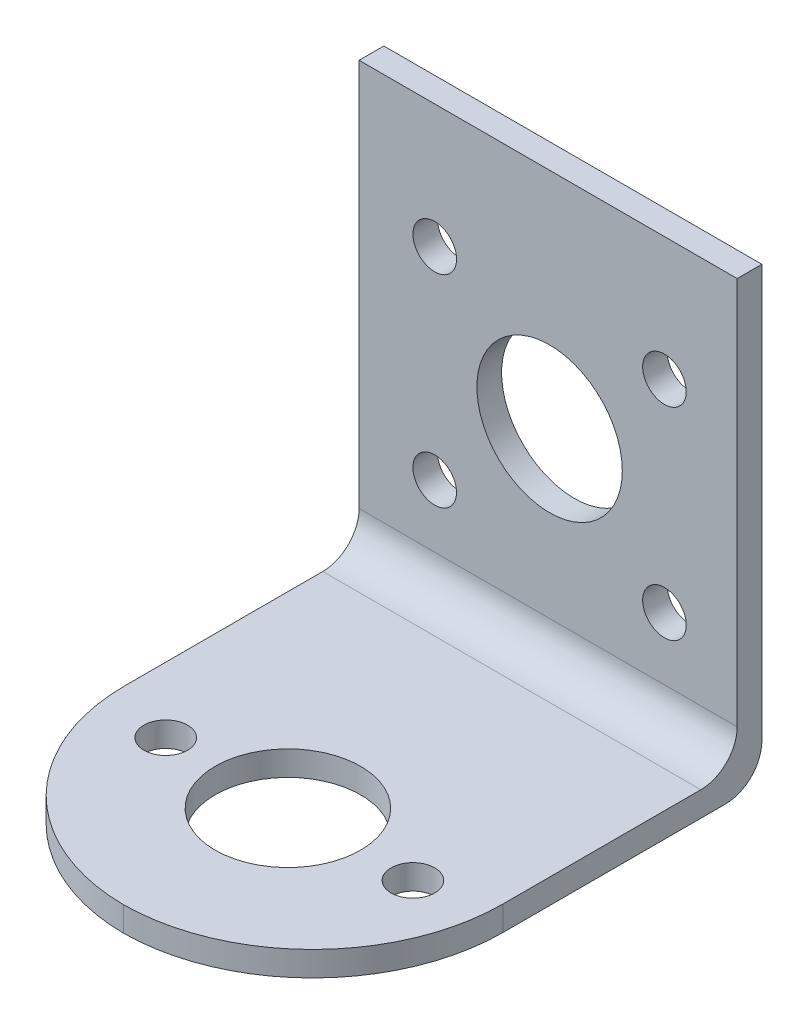
ISO-10303-21;
HEADER;
FILE_DESCRIPTION(('STEP AP214'),'2;1');
FILE_NAME('part.step','',(''),(''),'','','');
FILE_SCHEMA(('AUTOMOTIVE_DESIGN { 1 0 10303 214 1 1 1 1 }'));
ENDSEC;
DATA;
#1=APPLICATION_CONTEXT('core data for automotive mechanical design processes');
#2=APPLICATION_PROTOCOL_DEFINITION('international standard','automotive_design',2000,#1);
#3=PRODUCT_CONTEXT('',#1,'mechanical');
#4=PRODUCT('Part','Part','',(#3));
#5=PRODUCT_RELATED_PRODUCT_CATEGORY('part','',(#4));
#6=PRODUCT_DEFINITION_FORMATION('','',#4);
#7=PRODUCT_DEFINITION_CONTEXT('part definition',#1,'design');
#8=PRODUCT_DEFINITION('design','',#6,#7);
#9=PRODUCT_DEFINITION_SHAPE('','',#8);
#10=(LENGTH_UNIT() NAMED_UNIT(*) SI_UNIT(.MILLI.,.METRE.));
#11=(NAMED_UNIT(*) PLANE_ANGLE_UNIT() SI_UNIT($,.RADIAN.));
#12=(NAMED_UNIT(*) SI_UNIT($,.STERADIAN.) SOLID_ANGLE_UNIT());
#13=UNCERTAINTY_MEASURE_WITH_UNIT(LENGTH_MEASURE(1.E-05),#10,'distance_accuracy_value','');
#14=(GEOMETRIC_REPRESENTATION_CONTEXT(3) GLOBAL_UNCERTAINTY_ASSIGNED_CONTEXT((#13)) GLOBAL_UNIT_ASSIGNED_CONTEXT((#10,
#11,#12)) REPRESENTATION_CONTEXT('',''));
#15=CARTESIAN_POINT('',(0.,0.,0.));
#16=DIRECTION('',(0.,0.,1.));
#17=DIRECTION('',(1.,0.,0.));
#18=AXIS2_PLACEMENT_3D('',#15,#16,#17);
#19=CARTESIAN_POINT('',(-0.0999997773975889,-15.45,17.8));
#20=DIRECTION('',(0.,1.,0.));
#21=DIRECTION('',(0.,0.,1.));
#22=AXIS2_PLACEMENT_3D('',#19,#20,#21);
#23=CYLINDRICAL_SURFACE('',#22,13.1);
#24=CARTESIAN_POINT('',(-0.0999997773975889,-13.75,17.8));
#25=DIRECTION('',(0.,1.,0.));
#26=DIRECTION('',(0.,0.,1.));
#27=AXIS2_PLACEMENT_3D('',#24,#25,#26);
#28=CIRCLE('',#27,13.1);
#29=CARTESIAN_POINT('',(1.11301268792803E-07,-13.75,30.8996183158999));
#30=VERTEX_POINT('',#29);
#31=CARTESIAN_POINT('',(13.0000002226024,-13.75,17.8));
#32=VERTEX_POINT('',#31);
#33=EDGE_CURVE('E150',#30,#32,#28,.T.);
#34=ORIENTED_EDGE('',*,*,#33,.F.);
#35=DIRECTION('',(0.,1.,0.));
#36=VECTOR('',#35,1.);
#37=CARTESIAN_POINT('',(1.11301268792803E-07,-15.45,30.8996183158999));
#38=LINE('',#37,#36);
#39=CARTESIAN_POINT('',(1.11301268792803E-07,-15.45,30.8996183158999));
#40=VERTEX_POINT('',#39);
#41=EDGE_CURVE('E170',#40,#30,#38,.T.);
#42=ORIENTED_EDGE('',*,*,#41,.F.);
#43=CARTESIAN_POINT('',(-0.0999997773975889,-15.45,17.8));
#44=DIRECTION('',(0.,1.,0.));
#45=DIRECTION('',(0.,0.,1.));
#46=AXIS2_PLACEMENT_3D('',#43,#44,#45);
#47=CIRCLE('',#46,13.1);
#48=CARTESIAN_POINT('',(13.0000002226024,-15.45,17.8));
#49=VERTEX_POINT('',#48);
#50=EDGE_CURVE('E151',#40,#49,#47,.T.);
#51=ORIENTED_EDGE('',*,*,#50,.T.);
#52=DIRECTION('',(0.,1.,0.));
#53=VECTOR('',#52,1.);
#54=CARTESIAN_POINT('',(13.0000002226024,-15.45,17.8));
#55=LINE('',#54,#53);
#56=EDGE_CURVE('E122',#49,#32,#55,.T.);
#57=ORIENTED_EDGE('',*,*,#56,.T.);
#58=EDGE_LOOP('',(#34,#42,#51,#57));
#59=FACE_BOUND('',#58,.T.);
#60=ADVANCED_FACE('F41',(#59),#23,.T.);
#61=CARTESIAN_POINT('',(0.1,-15.45,17.8));
#62=DIRECTION('',(0.,1.,0.));
#63=DIRECTION('',(0.,0.,1.));
#64=AXIS2_PLACEMENT_3D('',#61,#62,#63);
#65=CYLINDRICAL_SURFACE('',#64,13.1);
#66=CARTESIAN_POINT('',(0.1,-13.75,17.8));
#67=DIRECTION('',(0.,1.,0.));
#68=DIRECTION('',(0.,0.,1.));
#69=AXIS2_PLACEMENT_3D('',#66,#67,#68);
#70=CIRCLE('',#69,13.1);
#71=CARTESIAN_POINT('',(-13.,-13.75,17.8));
#72=VERTEX_POINT('',#71);
#73=EDGE_CURVE('E155',#72,#30,#70,.T.);
#74=ORIENTED_EDGE('',*,*,#73,.F.);
#75=DIRECTION('',(0.,1.,0.));
#76=VECTOR('',#75,1.);
#77=CARTESIAN_POINT('',(-13.,-15.45,17.8));
#78=LINE('',#77,#76);
#79=CARTESIAN_POINT('',(-13.,-15.45,17.8));
#80=VERTEX_POINT('',#79);
#81=EDGE_CURVE('E173',#80,#72,#78,.T.);
#82=ORIENTED_EDGE('',*,*,#81,.F.);
#83=CARTESIAN_POINT('',(0.1,-15.45,17.8));
#84=DIRECTION('',(0.,1.,0.));
#85=DIRECTION('',(0.,0.,1.));
#86=AXIS2_PLACEMENT_3D('',#83,#84,#85);
#87=CIRCLE('',#86,13.1);
#88=EDGE_CURVE('E159',#80,#40,#87,.T.);
#89=ORIENTED_EDGE('',*,*,#88,.T.);
#90=ORIENTED_EDGE('',*,*,#41,.T.);
#91=EDGE_LOOP('',(#74,#82,#89,#90));
#92=FACE_BOUND('',#91,.T.);
#93=ADVANCED_FACE('F218',(#92),#65,.T.);
#94=CARTESIAN_POINT('',(-13.,-15.45,0.));
#95=DIRECTION('',(-1.,0.,0.));
#96=DIRECTION('',(0.,0.,1.));
#97=AXIS2_PLACEMENT_3D('',#94,#95,#96);
#98=PLANE('',#97);
#99=DIRECTION('',(0.,1.,0.));
#100=VECTOR('',#99,1.);
#101=CARTESIAN_POINT('',(-13.,-15.45,0.));
#102=LINE('',#101,#100);
#103=CARTESIAN_POINT('',(-13.,-12.95,0.));
#104=VERTEX_POINT('',#103);
#105=CARTESIAN_POINT('',(-13.,15.45,0.));
#106=VERTEX_POINT('',#105);
#107=EDGE_CURVE('E121',#104,#106,#102,.T.);
#108=ORIENTED_EDGE('',*,*,#107,.F.);
#109=CARTESIAN_POINT('',(-13.,-12.95,2.5));
#110=DIRECTION('',(-1.,0.,0.));
#111=DIRECTION('',(0.,0.,1.));
#112=AXIS2_PLACEMENT_3D('',#109,#110,#111);
#113=CIRCLE('',#112,2.5);
#114=CARTESIAN_POINT('',(-13.,-15.45,2.5));
#115=VERTEX_POINT('',#114);
#116=EDGE_CURVE('E179',#104,#115,#113,.T.);
#117=ORIENTED_EDGE('',*,*,#116,.T.);
#118=DIRECTION('',(0.,0.,1.));
#119=VECTOR('',#118,1.);
#120=CARTESIAN_POINT('',(-13.,-15.45,0.));
#121=LINE('',#120,#119);
#122=EDGE_CURVE('E157',#115,#80,#121,.T.);
#123=ORIENTED_EDGE('',*,*,#122,.T.);
#124=ORIENTED_EDGE('',*,*,#81,.T.);
#125=DIRECTION('',(0.,0.,1.));
#126=VECTOR('',#125,1.);
#127=CARTESIAN_POINT('',(-13.,-13.75,0.));
#128=LINE('',#127,#126);
#129=CARTESIAN_POINT('',(-13.,-13.75,4.2));
#130=VERTEX_POINT('',#129);
#131=EDGE_CURVE('E166',#130,#72,#128,.T.);
#132=ORIENTED_EDGE('',*,*,#131,.F.);
#133=CARTESIAN_POINT('',(-13.,-11.25,4.2));
#134=DIRECTION('',(-1.,0.,0.));
#135=DIRECTION('',(0.,0.,1.));
#136=AXIS2_PLACEMENT_3D('',#133,#134,#135);
#137=CIRCLE('',#136,2.5);
#138=CARTESIAN_POINT('',(-13.,-11.25,1.7));
#139=VERTEX_POINT('',#138);
#140=EDGE_CURVE('E11',#130,#139,#137,.F.);
#141=ORIENTED_EDGE('',*,*,#140,.T.);
#142=DIRECTION('',(0.,-1.,0.));
#143=VECTOR('',#142,1.);
#144=CARTESIAN_POINT('',(-13.,15.45,1.7));
#145=LINE('',#144,#143);
#146=CARTESIAN_POINT('',(-13.,15.45,1.7));
#147=VERTEX_POINT('',#146);
#148=EDGE_CURVE('E147',#147,#139,#145,.T.);
#149=ORIENTED_EDGE('',*,*,#148,.F.);
#150=DIRECTION('',(0.,0.,1.));
#151=VECTOR('',#150,1.);
#152=CARTESIAN_POINT('',(-13.,15.45,1.7));
#153=LINE('',#152,#151);
#154=EDGE_CURVE('E130',#106,#147,#153,.T.);
#155=ORIENTED_EDGE('',*,*,#154,.F.);
#156=EDGE_LOOP('',(#108,#117,#123,#124,#132,#141,#149,#155));
#157=FACE_BOUND('',#156,.T.);
#158=ADVANCED_FACE('F192',(#157),#98,.T.);
#159=CARTESIAN_POINT('',(13.0000002226024,-15.45,0.));
#160=DIRECTION('',(0.,0.,-1.));
#161=DIRECTION('',(-1.,0.,0.));
#162=AXIS2_PLACEMENT_3D('',#159,#160,#161);
#163=PLANE('',#162);
#164=CARTESIAN_POINT('',(-7.8,6.95,0.));
#165=DIRECTION('',(0.,0.,1.));
#166=DIRECTION('',(1.,0.,0.));
#167=AXIS2_PLACEMENT_3D('',#164,#165,#166);
#168=CIRCLE('',#167,1.49999999999999);
#169=CARTESIAN_POINT('',(-6.30000000000001,6.95,0.));
#170=VERTEX_POINT('',#169);
#171=EDGE_CURVE('E281',#170,#170,#168,.T.);
#172=ORIENTED_EDGE('',*,*,#171,.T.);
#173=EDGE_LOOP('',(#172));
#174=FACE_BOUND('',#173,.T.);
#175=CARTESIAN_POINT('',(8.,-6.95,0.));
#176=DIRECTION('',(0.,0.,1.));
#177=DIRECTION('',(1.,0.,0.));
#178=AXIS2_PLACEMENT_3D('',#175,#176,#177);
#179=CIRCLE('',#178,1.49999999999999);
#180=CARTESIAN_POINT('',(9.49999999999999,-6.95,0.));
#181=VERTEX_POINT('',#180);
#182=EDGE_CURVE('E276',#181,#181,#179,.T.);
#183=ORIENTED_EDGE('',*,*,#182,.T.);
#184=EDGE_LOOP('',(#183));
#185=FACE_BOUND('',#184,.T.);
#186=CARTESIAN_POINT('',(-7.8,-6.95,0.));
#187=DIRECTION('',(0.,0.,1.));
#188=DIRECTION('',(1.,0.,0.));
#189=AXIS2_PLACEMENT_3D('',#186,#187,#188);
#190=CIRCLE('',#189,1.49999999999999);
#191=CARTESIAN_POINT('',(-6.30000000000001,-6.95,0.));
#192=VERTEX_POINT('',#191);
#193=EDGE_CURVE('E292',#192,#192,#190,.T.);
#194=ORIENTED_EDGE('',*,*,#193,.T.);
#195=EDGE_LOOP('',(#194));
#196=FACE_BOUND('',#195,.T.);
#197=CARTESIAN_POINT('',(8.,6.95,0.));
#198=DIRECTION('',(0.,0.,1.));
#199=DIRECTION('',(1.,0.,0.));
#200=AXIS2_PLACEMENT_3D('',#197,#198,#199);
#201=CIRCLE('',#200,1.49999999999999);
#202=CARTESIAN_POINT('',(9.49999999999999,6.95,0.));
#203=VERTEX_POINT('',#202);
#204=EDGE_CURVE('E298',#203,#203,#201,.T.);
#205=ORIENTED_EDGE('',*,*,#204,.T.);
#206=EDGE_LOOP('',(#205));
#207=FACE_BOUND('',#206,.T.);
#208=CARTESIAN_POINT('',(0.1,0.0500000000000012,0.));
#209=DIRECTION('',(0.,0.,1.));
#210=DIRECTION('',(1.,0.,0.));
#211=AXIS2_PLACEMENT_3D('',#208,#209,#210);
#212=CIRCLE('',#211,4.99999999999999);
#213=CARTESIAN_POINT('',(5.09999999999999,0.0500000000000012,0.));
#214=VERTEX_POINT('',#213);
#215=EDGE_CURVE('E304',#214,#214,#212,.T.);
#216=ORIENTED_EDGE('',*,*,#215,.T.);
#217=EDGE_LOOP('',(#216));
#218=FACE_BOUND('',#217,.T.);
#219=DIRECTION('',(0.,1.,0.));
#220=VECTOR('',#219,1.);
#221=CARTESIAN_POINT('',(13.0000002226024,-15.45,0.));
#222=LINE('',#221,#220);
#223=CARTESIAN_POINT('',(13.0000002226024,-12.95,0.));
#224=VERTEX_POINT('',#223);
#225=CARTESIAN_POINT('',(13.,15.45,0.));
#226=VERTEX_POINT('',#225);
#227=EDGE_CURVE('E110',#224,#226,#222,.T.);
#228=ORIENTED_EDGE('',*,*,#227,.F.);
#229=DIRECTION('',(-1.,0.,0.));
#230=VECTOR('',#229,1.);
#231=CARTESIAN_POINT('',(-13.,-12.95,0.));
#232=LINE('',#231,#230);
#233=EDGE_CURVE('E172',#224,#104,#232,.T.);
#234=ORIENTED_EDGE('',*,*,#233,.T.);
#235=ORIENTED_EDGE('',*,*,#107,.T.);
#236=DIRECTION('',(-1.,0.,0.));
#237=VECTOR('',#236,1.);
#238=CARTESIAN_POINT('',(-13.,15.45,0.));
#239=LINE('',#238,#237);
#240=EDGE_CURVE('E125',#226,#106,#239,.T.);
#241=ORIENTED_EDGE('',*,*,#240,.F.);
#242=EDGE_LOOP('',(#228,#234,#235,#241));
#243=FACE_BOUND('',#242,.T.);
#244=ADVANCED_FACE('F126',(#174,#185,#196,#207,#218,#243),#163,.T.);
#245=CARTESIAN_POINT('',(13.0000002226024,-15.45,17.8));
#246=DIRECTION('',(1.,0.,0.));
#247=DIRECTION('',(0.,0.,-1.));
#248=AXIS2_PLACEMENT_3D('',#245,#246,#247);
#249=PLANE('',#248);
#250=DIRECTION('',(0.,0.,-1.));
#251=VECTOR('',#250,1.);
#252=CARTESIAN_POINT('',(13.0000002226024,-15.45,17.8));
#253=LINE('',#252,#251);
#254=CARTESIAN_POINT('',(13.0000002226024,-15.45,2.5));
#255=VERTEX_POINT('',#254);
#256=EDGE_CURVE('E154',#49,#255,#253,.T.);
#257=ORIENTED_EDGE('',*,*,#256,.T.);
#258=CARTESIAN_POINT('',(13.0000002226024,-12.95,2.5));
#259=DIRECTION('',(1.,0.,0.));
#260=DIRECTION('',(0.,0.,-1.));
#261=AXIS2_PLACEMENT_3D('',#258,#259,#260);
#262=CIRCLE('',#261,2.5);
#263=EDGE_CURVE('E117',#255,#224,#262,.T.);
#264=ORIENTED_EDGE('',*,*,#263,.T.);
#265=ORIENTED_EDGE('',*,*,#227,.T.);
#266=DIRECTION('',(0.,0.,-1.));
#267=VECTOR('',#266,1.);
#268=CARTESIAN_POINT('',(13.,15.45,0.));
#269=LINE('',#268,#267);
#270=CARTESIAN_POINT('',(13.,15.45,1.7));
#271=VERTEX_POINT('',#270);
#272=EDGE_CURVE('E115',#271,#226,#269,.T.);
#273=ORIENTED_EDGE('',*,*,#272,.F.);
#274=DIRECTION('',(0.,-1.,0.));
#275=VECTOR('',#274,1.);
#276=CARTESIAN_POINT('',(13.,15.45,1.7));
#277=LINE('',#276,#275);
#278=CARTESIAN_POINT('',(13.,-11.25,1.7));
#279=VERTEX_POINT('',#278);
#280=EDGE_CURVE('E145',#271,#279,#277,.T.);
#281=ORIENTED_EDGE('',*,*,#280,.T.);
#282=CARTESIAN_POINT('',(13.0000002226024,-11.25,4.2));
#283=DIRECTION('',(1.,0.,0.));
#284=DIRECTION('',(0.,0.,-1.));
#285=AXIS2_PLACEMENT_3D('',#282,#283,#284);
#286=CIRCLE('',#285,2.5);
#287=CARTESIAN_POINT('',(13.0000002226024,-13.75,4.2));
#288=VERTEX_POINT('',#287);
#289=EDGE_CURVE('E49',#279,#288,#286,.F.);
#290=ORIENTED_EDGE('',*,*,#289,.T.);
#291=DIRECTION('',(0.,0.,-1.));
#292=VECTOR('',#291,1.);
#293=CARTESIAN_POINT('',(13.0000002226024,-13.75,17.8));
#294=LINE('',#293,#292);
#295=EDGE_CURVE('E164',#32,#288,#294,.T.);
#296=ORIENTED_EDGE('',*,*,#295,.F.);
#297=ORIENTED_EDGE('',*,*,#56,.F.);
#298=EDGE_LOOP('',(#257,#264,#265,#273,#281,#290,#296,#297));
#299=FACE_BOUND('',#298,.T.);
#300=ADVANCED_FACE('F113',(#299),#249,.T.);
#301=CARTESIAN_POINT('',(-0.0999997773975889,-15.45,17.8));
#302=DIRECTION('',(0.,1.,0.));
#303=DIRECTION('',(0.,0.,1.));
#304=AXIS2_PLACEMENT_3D('',#301,#302,#303);
#305=PLANE('',#304);
#306=CARTESIAN_POINT('',(8.5,-15.45,19.5));
#307=DIRECTION('',(0.,1.,0.));
#308=DIRECTION('',(0.,0.,1.));
#309=AXIS2_PLACEMENT_3D('',#306,#307,#308);
#310=CIRCLE('',#309,1.49999999999999);
#311=CARTESIAN_POINT('',(8.5,-15.45,21.));
#312=VERTEX_POINT('',#311);
#313=EDGE_CURVE('E310',#312,#312,#310,.T.);
#314=ORIENTED_EDGE('',*,*,#313,.T.);
#315=EDGE_LOOP('',(#314));
#316=FACE_BOUND('',#315,.T.);
#317=CARTESIAN_POINT('',(-8.5,-15.45,19.5));
#318=DIRECTION('',(0.,1.,0.));
#319=DIRECTION('',(0.,0.,1.));
#320=AXIS2_PLACEMENT_3D('',#317,#318,#319);
#321=CIRCLE('',#320,1.49999999999999);
#322=CARTESIAN_POINT('',(-8.5,-15.45,21.));
#323=VERTEX_POINT('',#322);
#324=EDGE_CURVE('E316',#323,#323,#321,.T.);
#325=ORIENTED_EDGE('',*,*,#324,.T.);
#326=EDGE_LOOP('',(#325));
#327=FACE_BOUND('',#326,.T.);
#328=CARTESIAN_POINT('',(-0.0999998062849059,-15.45,19.5));
#329=DIRECTION('',(0.,1.,0.));
#330=DIRECTION('',(0.,0.,1.));
#331=AXIS2_PLACEMENT_3D('',#328,#329,#330);
#332=CIRCLE('',#331,4.99999999999999);
#333=CARTESIAN_POINT('',(-0.0999998062849059,-15.45,24.5));
#334=VERTEX_POINT('',#333);
#335=EDGE_CURVE('E136',#334,#334,#332,.T.);
#336=ORIENTED_EDGE('',*,*,#335,.T.);
#337=EDGE_LOOP('',(#336));
#338=FACE_BOUND('',#337,.T.);
#339=ORIENTED_EDGE('',*,*,#122,.F.);
#340=DIRECTION('',(-1.,0.,0.));
#341=VECTOR('',#340,1.);
#342=CARTESIAN_POINT('',(13.0000002226024,-15.45,2.5));
#343=LINE('',#342,#341);
#344=EDGE_CURVE('E181',#115,#255,#343,.F.);
#345=ORIENTED_EDGE('',*,*,#344,.T.);
#346=ORIENTED_EDGE('',*,*,#256,.F.);
#347=ORIENTED_EDGE('',*,*,#50,.F.);
#348=ORIENTED_EDGE('',*,*,#88,.F.);
#349=EDGE_LOOP('',(#339,#345,#346,#347,#348));
#350=FACE_BOUND('',#349,.T.);
#351=ADVANCED_FACE('F203',(#316,#327,#338,#350),#305,.F.);
#352=CARTESIAN_POINT('',(-0.0999997773975889,-13.75,17.8));
#353=DIRECTION('',(0.,1.,0.));
#354=DIRECTION('',(0.,0.,1.));
#355=AXIS2_PLACEMENT_3D('',#352,#353,#354);
#356=PLANE('',#355);
#357=CARTESIAN_POINT('',(8.5,-13.75,19.5));
#358=DIRECTION('',(0.,1.,0.));
#359=DIRECTION('',(0.,0.,1.));
#360=AXIS2_PLACEMENT_3D('',#357,#358,#359);
#361=CIRCLE('',#360,1.49999999999999);
#362=CARTESIAN_POINT('',(8.5,-13.75,21.));
#363=VERTEX_POINT('',#362);
#364=EDGE_CURVE('E307',#363,#363,#361,.T.);
#365=ORIENTED_EDGE('',*,*,#364,.F.);
#366=EDGE_LOOP('',(#365));
#367=FACE_BOUND('',#366,.T.);
#368=CARTESIAN_POINT('',(-8.5,-13.75,19.5));
#369=DIRECTION('',(0.,1.,0.));
#370=DIRECTION('',(0.,0.,1.));
#371=AXIS2_PLACEMENT_3D('',#368,#369,#370);
#372=CIRCLE('',#371,1.49999999999999);
#373=CARTESIAN_POINT('',(-8.5,-13.75,21.));
#374=VERTEX_POINT('',#373);
#375=EDGE_CURVE('E313',#374,#374,#372,.T.);
#376=ORIENTED_EDGE('',*,*,#375,.F.);
#377=EDGE_LOOP('',(#376));
#378=FACE_BOUND('',#377,.T.);
#379=CARTESIAN_POINT('',(-0.0999998062849059,-13.75,19.5));
#380=DIRECTION('',(0.,1.,0.));
#381=DIRECTION('',(0.,0.,1.));
#382=AXIS2_PLACEMENT_3D('',#379,#380,#381);
#383=CIRCLE('',#382,4.99999999999999);
#384=CARTESIAN_POINT('',(-0.0999998062849059,-13.75,24.5));
#385=VERTEX_POINT('',#384);
#386=EDGE_CURVE('E139',#385,#385,#383,.T.);
#387=ORIENTED_EDGE('',*,*,#386,.F.);
#388=EDGE_LOOP('',(#387));
#389=FACE_BOUND('',#388,.T.);
#390=ORIENTED_EDGE('',*,*,#295,.T.);
#391=DIRECTION('',(1.,0.,0.));
#392=VECTOR('',#391,1.);
#393=CARTESIAN_POINT('',(-0.0999997773975889,-13.75,4.2));
#394=LINE('',#393,#392);
#395=EDGE_CURVE('E186',#288,#130,#394,.F.);
#396=ORIENTED_EDGE('',*,*,#395,.T.);
#397=ORIENTED_EDGE('',*,*,#131,.T.);
#398=ORIENTED_EDGE('',*,*,#73,.T.);
#399=ORIENTED_EDGE('',*,*,#33,.T.);
#400=EDGE_LOOP('',(#390,#396,#397,#398,#399));
#401=FACE_BOUND('',#400,.T.);
#402=ADVANCED_FACE('F189',(#367,#378,#389,#401),#356,.T.);
#403=CARTESIAN_POINT('',(13.,15.45,1.7));
#404=DIRECTION('',(0.,0.,-1.));
#405=DIRECTION('',(-1.,0.,0.));
#406=AXIS2_PLACEMENT_3D('',#403,#404,#405);
#407=PLANE('',#406);
#408=CARTESIAN_POINT('',(-7.8,6.95,1.7));
#409=DIRECTION('',(0.,0.,1.));
#410=DIRECTION('',(1.,0.,0.));
#411=AXIS2_PLACEMENT_3D('',#408,#409,#410);
#412=CIRCLE('',#411,1.49999999999999);
#413=CARTESIAN_POINT('',(-6.30000000000001,6.95,1.7));
#414=VERTEX_POINT('',#413);
#415=EDGE_CURVE('E286',#414,#414,#412,.T.);
#416=ORIENTED_EDGE('',*,*,#415,.F.);
#417=EDGE_LOOP('',(#416));
#418=FACE_BOUND('',#417,.T.);
#419=CARTESIAN_POINT('',(8.,-6.95,1.7));
#420=DIRECTION('',(0.,0.,1.));
#421=DIRECTION('',(1.,0.,0.));
#422=AXIS2_PLACEMENT_3D('',#419,#420,#421);
#423=CIRCLE('',#422,1.49999999999999);
#424=CARTESIAN_POINT('',(9.49999999999999,-6.95,1.7));
#425=VERTEX_POINT('',#424);
#426=EDGE_CURVE('E279',#425,#425,#423,.T.);
#427=ORIENTED_EDGE('',*,*,#426,.F.);
#428=EDGE_LOOP('',(#427));
#429=FACE_BOUND('',#428,.T.);
#430=CARTESIAN_POINT('',(-7.8,-6.95,1.7));
#431=DIRECTION('',(0.,0.,1.));
#432=DIRECTION('',(1.,0.,0.));
#433=AXIS2_PLACEMENT_3D('',#430,#431,#432);
#434=CIRCLE('',#433,1.49999999999999);
#435=CARTESIAN_POINT('',(-6.30000000000001,-6.95,1.7));
#436=VERTEX_POINT('',#435);
#437=EDGE_CURVE('E283',#436,#436,#434,.T.);
#438=ORIENTED_EDGE('',*,*,#437,.F.);
#439=EDGE_LOOP('',(#438));
#440=FACE_BOUND('',#439,.T.);
#441=CARTESIAN_POINT('',(8.,6.95,1.7));
#442=DIRECTION('',(0.,0.,1.));
#443=DIRECTION('',(1.,0.,0.));
#444=AXIS2_PLACEMENT_3D('',#441,#442,#443);
#445=CIRCLE('',#444,1.49999999999999);
#446=CARTESIAN_POINT('',(9.49999999999999,6.95,1.7));
#447=VERTEX_POINT('',#446);
#448=EDGE_CURVE('E295',#447,#447,#445,.T.);
#449=ORIENTED_EDGE('',*,*,#448,.F.);
#450=EDGE_LOOP('',(#449));
#451=FACE_BOUND('',#450,.T.);
#452=CARTESIAN_POINT('',(0.1,0.0500000000000012,1.7));
#453=DIRECTION('',(0.,0.,1.));
#454=DIRECTION('',(1.,0.,0.));
#455=AXIS2_PLACEMENT_3D('',#452,#453,#454);
#456=CIRCLE('',#455,4.99999999999999);
#457=CARTESIAN_POINT('',(5.09999999999999,0.0500000000000012,1.7));
#458=VERTEX_POINT('',#457);
#459=EDGE_CURVE('E301',#458,#458,#456,.T.);
#460=ORIENTED_EDGE('',*,*,#459,.F.);
#461=EDGE_LOOP('',(#460));
#462=FACE_BOUND('',#461,.T.);
#463=ORIENTED_EDGE('',*,*,#148,.T.);
#464=DIRECTION('',(1.,0.,0.));
#465=VECTOR('',#464,1.);
#466=CARTESIAN_POINT('',(13.,-11.25,1.7));
#467=LINE('',#466,#465);
#468=EDGE_CURVE('E184',#139,#279,#467,.T.);
#469=ORIENTED_EDGE('',*,*,#468,.T.);
#470=ORIENTED_EDGE('',*,*,#280,.F.);
#471=DIRECTION('',(1.,0.,0.));
#472=VECTOR('',#471,1.);
#473=CARTESIAN_POINT('',(13.,15.45,1.7));
#474=LINE('',#473,#472);
#475=EDGE_CURVE('E134',#147,#271,#474,.T.);
#476=ORIENTED_EDGE('',*,*,#475,.F.);
#477=EDGE_LOOP('',(#463,#469,#470,#476));
#478=FACE_BOUND('',#477,.T.);
#479=ADVANCED_FACE('F197',(#418,#429,#440,#451,#462,#478),#407,.F.);
#480=CARTESIAN_POINT('',(0.,15.45,0.));
#481=DIRECTION('',(0.,-1.,0.));
#482=DIRECTION('',(0.,0.,-1.));
#483=AXIS2_PLACEMENT_3D('',#480,#481,#482);
#484=PLANE('',#483);
#485=ORIENTED_EDGE('',*,*,#272,.T.);
#486=ORIENTED_EDGE('',*,*,#240,.T.);
#487=ORIENTED_EDGE('',*,*,#154,.T.);
#488=ORIENTED_EDGE('',*,*,#475,.T.);
#489=EDGE_LOOP('',(#485,#486,#487,#488));
#490=FACE_BOUND('',#489,.T.);
#491=ADVANCED_FACE('F132',(#490),#484,.F.);
#492=CARTESIAN_POINT('',(-0.0999998062849059,-13.75,19.5));
#493=DIRECTION('',(0.,1.,0.));
#494=DIRECTION('',(0.,0.,1.));
#495=AXIS2_PLACEMENT_3D('',#492,#493,#494);
#496=CYLINDRICAL_SURFACE('',#495,4.99999999999999);
#497=ORIENTED_EDGE('',*,*,#335,.F.);
#498=EDGE_LOOP('',(#497));
#499=FACE_BOUND('',#498,.T.);
#500=ORIENTED_EDGE('',*,*,#386,.T.);
#501=EDGE_LOOP('',(#500));
#502=FACE_BOUND('',#501,.T.);
#503=ADVANCED_FACE('F245',(#499,#502),#496,.F.);
#504=CARTESIAN_POINT('',(-8.5,-13.75,19.5));
#505=DIRECTION('',(0.,1.,0.));
#506=DIRECTION('',(0.,0.,1.));
#507=AXIS2_PLACEMENT_3D('',#504,#505,#506);
#508=CYLINDRICAL_SURFACE('',#507,1.49999999999999);
#509=ORIENTED_EDGE('',*,*,#324,.F.);
#510=EDGE_LOOP('',(#509));
#511=FACE_BOUND('',#510,.T.);
#512=ORIENTED_EDGE('',*,*,#375,.T.);
#513=EDGE_LOOP('',(#512));
#514=FACE_BOUND('',#513,.T.);
#515=ADVANCED_FACE('F248',(#511,#514),#508,.F.);
#516=CARTESIAN_POINT('',(8.5,-13.75,19.5));
#517=DIRECTION('',(0.,1.,0.));
#518=DIRECTION('',(0.,0.,1.));
#519=AXIS2_PLACEMENT_3D('',#516,#517,#518);
#520=CYLINDRICAL_SURFACE('',#519,1.49999999999999);
#521=ORIENTED_EDGE('',*,*,#313,.F.);
#522=EDGE_LOOP('',(#521));
#523=FACE_BOUND('',#522,.T.);
#524=ORIENTED_EDGE('',*,*,#364,.T.);
#525=EDGE_LOOP('',(#524));
#526=FACE_BOUND('',#525,.T.);
#527=ADVANCED_FACE('F252',(#523,#526),#520,.F.);
#528=CARTESIAN_POINT('',(0.1,0.0500000000000012,1.7));
#529=DIRECTION('',(0.,0.,1.));
#530=DIRECTION('',(1.,0.,0.));
#531=AXIS2_PLACEMENT_3D('',#528,#529,#530);
#532=CYLINDRICAL_SURFACE('',#531,4.99999999999999);
#533=ORIENTED_EDGE('',*,*,#215,.F.);
#534=EDGE_LOOP('',(#533));
#535=FACE_BOUND('',#534,.T.);
#536=ORIENTED_EDGE('',*,*,#459,.T.);
#537=EDGE_LOOP('',(#536));
#538=FACE_BOUND('',#537,.T.);
#539=ADVANCED_FACE('F256',(#535,#538),#532,.F.);
#540=CARTESIAN_POINT('',(8.,6.95,1.7));
#541=DIRECTION('',(0.,0.,1.));
#542=DIRECTION('',(1.,0.,0.));
#543=AXIS2_PLACEMENT_3D('',#540,#541,#542);
#544=CYLINDRICAL_SURFACE('',#543,1.49999999999999);
#545=ORIENTED_EDGE('',*,*,#204,.F.);
#546=EDGE_LOOP('',(#545));
#547=FACE_BOUND('',#546,.T.);
#548=ORIENTED_EDGE('',*,*,#448,.T.);
#549=EDGE_LOOP('',(#548));
#550=FACE_BOUND('',#549,.T.);
#551=ADVANCED_FACE('F260',(#547,#550),#544,.F.);
#552=CARTESIAN_POINT('',(-7.8,-6.95,1.7));
#553=DIRECTION('',(0.,0.,1.));
#554=DIRECTION('',(1.,0.,0.));
#555=AXIS2_PLACEMENT_3D('',#552,#553,#554);
#556=CYLINDRICAL_SURFACE('',#555,1.49999999999999);
#557=ORIENTED_EDGE('',*,*,#193,.F.);
#558=EDGE_LOOP('',(#557));
#559=FACE_BOUND('',#558,.T.);
#560=ORIENTED_EDGE('',*,*,#437,.T.);
#561=EDGE_LOOP('',(#560));
#562=FACE_BOUND('',#561,.T.);
#563=ADVANCED_FACE('F264',(#559,#562),#556,.F.);
#564=CARTESIAN_POINT('',(8.,-6.95,1.7));
#565=DIRECTION('',(0.,0.,1.));
#566=DIRECTION('',(1.,0.,0.));
#567=AXIS2_PLACEMENT_3D('',#564,#565,#566);
#568=CYLINDRICAL_SURFACE('',#567,1.49999999999999);
#569=ORIENTED_EDGE('',*,*,#182,.F.);
#570=EDGE_LOOP('',(#569));
#571=FACE_BOUND('',#570,.T.);
#572=ORIENTED_EDGE('',*,*,#426,.T.);
#573=EDGE_LOOP('',(#572));
#574=FACE_BOUND('',#573,.T.);
#575=ADVANCED_FACE('F213',(#571,#574),#568,.F.);
#576=CARTESIAN_POINT('',(-7.8,6.95,1.7));
#577=DIRECTION('',(0.,0.,1.));
#578=DIRECTION('',(1.,0.,0.));
#579=AXIS2_PLACEMENT_3D('',#576,#577,#578);
#580=CYLINDRICAL_SURFACE('',#579,1.49999999999999);
#581=ORIENTED_EDGE('',*,*,#171,.F.);
#582=EDGE_LOOP('',(#581));
#583=FACE_BOUND('',#582,.T.);
#584=ORIENTED_EDGE('',*,*,#415,.T.);
#585=EDGE_LOOP('',(#584));
#586=FACE_BOUND('',#585,.T.);
#587=ADVANCED_FACE('F208',(#583,#586),#580,.F.);
#588=CARTESIAN_POINT('',(13.0000002226024,-12.95,2.5));
#589=DIRECTION('',(1.,0.,0.));
#590=DIRECTION('',(0.,0.,-1.));
#591=AXIS2_PLACEMENT_3D('',#588,#589,#590);
#592=CYLINDRICAL_SURFACE('',#591,2.5);
#593=ORIENTED_EDGE('',*,*,#263,.F.);
#594=ORIENTED_EDGE('',*,*,#344,.F.);
#595=ORIENTED_EDGE('',*,*,#116,.F.);
#596=ORIENTED_EDGE('',*,*,#233,.F.);
#597=EDGE_LOOP('',(#593,#594,#595,#596));
#598=FACE_BOUND('',#597,.T.);
#599=ADVANCED_FACE('F206',(#598),#592,.T.);
#600=CARTESIAN_POINT('',(13.,-11.25,4.2));
#601=DIRECTION('',(1.,0.,0.));
#602=DIRECTION('',(0.,0.,-1.));
#603=AXIS2_PLACEMENT_3D('',#600,#601,#602);
#604=CYLINDRICAL_SURFACE('',#603,2.5);
#605=ORIENTED_EDGE('',*,*,#140,.F.);
#606=ORIENTED_EDGE('',*,*,#395,.F.);
#607=ORIENTED_EDGE('',*,*,#289,.F.);
#608=ORIENTED_EDGE('',*,*,#468,.F.);
#609=EDGE_LOOP('',(#605,#606,#607,#608));
#610=FACE_BOUND('',#609,.T.);
#611=ADVANCED_FACE('F43',(#610),#604,.F.);
#612=CLOSED_SHELL('',(#60,#93,#158,#244,#300,#351,#402,#479,#491,#503,#515,#527,#539,#551,#563,
#575,#587,#599,#611));
#613=MANIFOLD_SOLID_BREP('B2',#612);
#614=ADVANCED_BREP_SHAPE_REPRESENTATION('',(#18,#613),#14);
#615=SHAPE_DEFINITION_REPRESENTATION(#9,#614);
ENDSEC;
END-ISO-10303-21;
